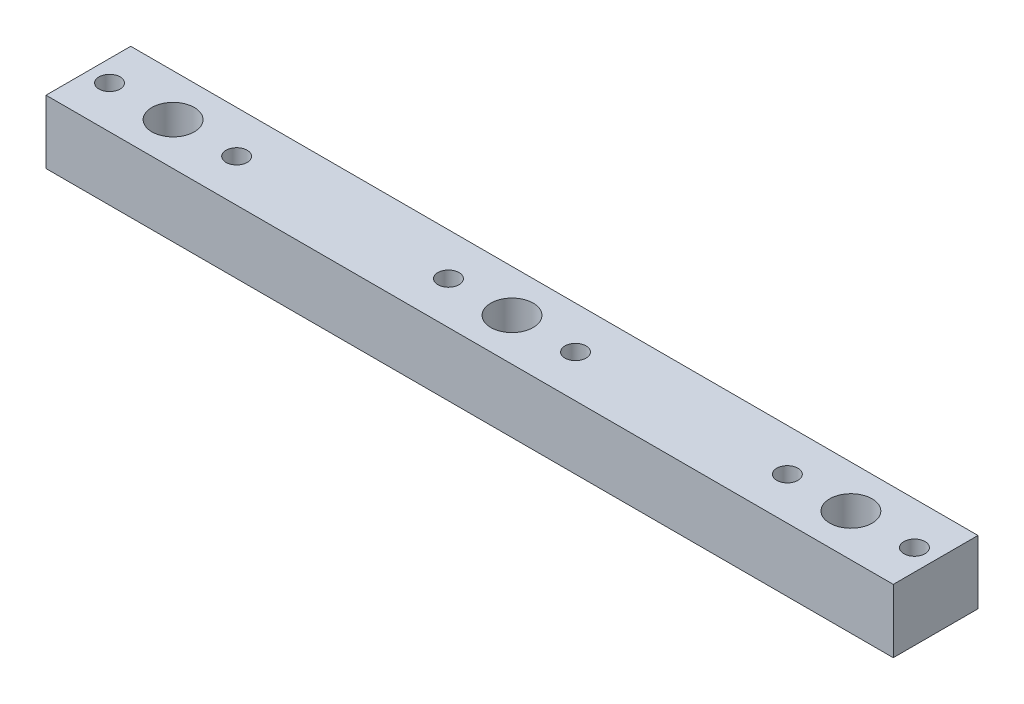
ISO-10303-21;
HEADER;
FILE_DESCRIPTION(('STEP AP214'),'2;1');
FILE_NAME('part.step','',(''),(''),'','','');
FILE_SCHEMA(('AUTOMOTIVE_DESIGN { 1 0 10303 214 1 1 1 1 }'));
ENDSEC;
DATA;
#1=APPLICATION_CONTEXT('core data for automotive mechanical design processes');
#2=APPLICATION_PROTOCOL_DEFINITION('international standard','automotive_design',2000,#1);
#3=PRODUCT_CONTEXT('',#1,'mechanical');
#4=PRODUCT('Part','Part','',(#3));
#5=PRODUCT_RELATED_PRODUCT_CATEGORY('part','',(#4));
#6=PRODUCT_DEFINITION_FORMATION('','',#4);
#7=PRODUCT_DEFINITION_CONTEXT('part definition',#1,'design');
#8=PRODUCT_DEFINITION('design','',#6,#7);
#9=PRODUCT_DEFINITION_SHAPE('','',#8);
#10=(LENGTH_UNIT() NAMED_UNIT(*) SI_UNIT(.MILLI.,.METRE.));
#11=(NAMED_UNIT(*) PLANE_ANGLE_UNIT() SI_UNIT($,.RADIAN.));
#12=(NAMED_UNIT(*) SI_UNIT($,.STERADIAN.) SOLID_ANGLE_UNIT());
#13=UNCERTAINTY_MEASURE_WITH_UNIT(LENGTH_MEASURE(1.E-05),#10,'distance_accuracy_value','');
#14=(GEOMETRIC_REPRESENTATION_CONTEXT(3) GLOBAL_UNCERTAINTY_ASSIGNED_CONTEXT((#13)) GLOBAL_UNIT_ASSIGNED_CONTEXT((#10,
#11,#12)) REPRESENTATION_CONTEXT('',''));
#15=CARTESIAN_POINT('',(0.,0.,0.));
#16=DIRECTION('',(0.,0.,1.));
#17=DIRECTION('',(1.,0.,0.));
#18=AXIS2_PLACEMENT_3D('',#15,#16,#17);
#19=CARTESIAN_POINT('',(0.,15.,0.));
#20=DIRECTION('',(0.,-1.,0.));
#21=DIRECTION('',(0.,0.,-1.));
#22=AXIS2_PLACEMENT_3D('',#19,#20,#21);
#23=PLANE('',#22);
#24=DIRECTION('',(0.,0.,1.));
#25=VECTOR('',#24,1.);
#26=CARTESIAN_POINT('',(0.,15.,0.));
#27=LINE('',#26,#25);
#28=CARTESIAN_POINT('',(0.,15.,-20.));
#29=VERTEX_POINT('',#28);
#30=CARTESIAN_POINT('',(0.,15.,0.));
#31=VERTEX_POINT('',#30);
#32=EDGE_CURVE('E92',#29,#31,#27,.T.);
#33=ORIENTED_EDGE('',*,*,#32,.T.);
#34=DIRECTION('',(1.,0.,0.));
#35=VECTOR('',#34,1.);
#36=CARTESIAN_POINT('',(0.,15.,0.));
#37=LINE('',#36,#35);
#38=CARTESIAN_POINT('',(200.,15.,0.));
#39=VERTEX_POINT('',#38);
#40=EDGE_CURVE('E87',#31,#39,#37,.T.);
#41=ORIENTED_EDGE('',*,*,#40,.T.);
#42=DIRECTION('',(0.,0.,-1.));
#43=VECTOR('',#42,1.);
#44=CARTESIAN_POINT('',(200.,15.,0.));
#45=LINE('',#44,#43);
#46=CARTESIAN_POINT('',(200.,15.,-20.));
#47=VERTEX_POINT('',#46);
#48=EDGE_CURVE('E90',#39,#47,#45,.T.);
#49=ORIENTED_EDGE('',*,*,#48,.T.);
#50=DIRECTION('',(-1.,0.,0.));
#51=VECTOR('',#50,1.);
#52=CARTESIAN_POINT('',(0.,15.,-20.));
#53=LINE('',#52,#51);
#54=EDGE_CURVE('E57',#47,#29,#53,.T.);
#55=ORIENTED_EDGE('',*,*,#54,.T.);
#56=EDGE_LOOP('',(#33,#41,#49,#55));
#57=FACE_BOUND('',#56,.T.);
#58=CARTESIAN_POINT('',(20.,15.,-10.));
#59=DIRECTION('',(0.,1.,0.));
#60=DIRECTION('',(0.,0.,1.));
#61=AXIS2_PLACEMENT_3D('',#58,#59,#60);
#62=CIRCLE('',#61,5.);
#63=CARTESIAN_POINT('',(20.,15.,-5.));
#64=VERTEX_POINT('',#63);
#65=EDGE_CURVE('E112',#64,#64,#62,.T.);
#66=ORIENTED_EDGE('',*,*,#65,.F.);
#67=EDGE_LOOP('',(#66));
#68=FACE_BOUND('',#67,.T.);
#69=CARTESIAN_POINT('',(35.,15.,-10.));
#70=DIRECTION('',(0.,1.,0.));
#71=DIRECTION('',(0.,0.,1.));
#72=AXIS2_PLACEMENT_3D('',#69,#70,#71);
#73=CIRCLE('',#72,2.49999999999999);
#74=CARTESIAN_POINT('',(35.,15.,-7.50000000000001));
#75=VERTEX_POINT('',#74);
#76=EDGE_CURVE('E134',#75,#75,#73,.T.);
#77=ORIENTED_EDGE('',*,*,#76,.F.);
#78=EDGE_LOOP('',(#77));
#79=FACE_BOUND('',#78,.T.);
#80=CARTESIAN_POINT('',(5.,15.,-10.));
#81=DIRECTION('',(0.,1.,0.));
#82=DIRECTION('',(0.,0.,1.));
#83=AXIS2_PLACEMENT_3D('',#80,#81,#82);
#84=CIRCLE('',#83,2.5);
#85=CARTESIAN_POINT('',(5.,15.,-7.50000000000001));
#86=VERTEX_POINT('',#85);
#87=EDGE_CURVE('E142',#86,#86,#84,.T.);
#88=ORIENTED_EDGE('',*,*,#87,.F.);
#89=EDGE_LOOP('',(#88));
#90=FACE_BOUND('',#89,.T.);
#91=CARTESIAN_POINT('',(100.,15.,-10.));
#92=DIRECTION('',(0.,1.,0.));
#93=DIRECTION('',(0.,0.,1.));
#94=AXIS2_PLACEMENT_3D('',#91,#92,#93);
#95=CIRCLE('',#94,5.);
#96=CARTESIAN_POINT('',(100.,15.,-5.));
#97=VERTEX_POINT('',#96);
#98=EDGE_CURVE('E150',#97,#97,#95,.T.);
#99=ORIENTED_EDGE('',*,*,#98,.F.);
#100=EDGE_LOOP('',(#99));
#101=FACE_BOUND('',#100,.T.);
#102=CARTESIAN_POINT('',(180.,15.,-10.));
#103=DIRECTION('',(0.,1.,0.));
#104=DIRECTION('',(0.,0.,1.));
#105=AXIS2_PLACEMENT_3D('',#102,#103,#104);
#106=CIRCLE('',#105,4.99999999999999);
#107=CARTESIAN_POINT('',(180.,15.,-5.00000000000001));
#108=VERTEX_POINT('',#107);
#109=EDGE_CURVE('E158',#108,#108,#106,.T.);
#110=ORIENTED_EDGE('',*,*,#109,.F.);
#111=EDGE_LOOP('',(#110));
#112=FACE_BOUND('',#111,.T.);
#113=CARTESIAN_POINT('',(195.,15.,-10.));
#114=DIRECTION('',(0.,1.,0.));
#115=DIRECTION('',(0.,0.,1.));
#116=AXIS2_PLACEMENT_3D('',#113,#114,#115);
#117=CIRCLE('',#116,2.50000000000002);
#118=CARTESIAN_POINT('',(195.,15.,-7.49999999999998));
#119=VERTEX_POINT('',#118);
#120=EDGE_CURVE('E166',#119,#119,#117,.T.);
#121=ORIENTED_EDGE('',*,*,#120,.F.);
#122=EDGE_LOOP('',(#121));
#123=FACE_BOUND('',#122,.T.);
#124=CARTESIAN_POINT('',(165.,15.,-10.));
#125=DIRECTION('',(0.,1.,0.));
#126=DIRECTION('',(0.,0.,1.));
#127=AXIS2_PLACEMENT_3D('',#124,#125,#126);
#128=CIRCLE('',#127,2.50000000000002);
#129=CARTESIAN_POINT('',(165.,15.,-7.49999999999998));
#130=VERTEX_POINT('',#129);
#131=EDGE_CURVE('E174',#130,#130,#128,.T.);
#132=ORIENTED_EDGE('',*,*,#131,.F.);
#133=EDGE_LOOP('',(#132));
#134=FACE_BOUND('',#133,.T.);
#135=CARTESIAN_POINT('',(115.,15.,-10.));
#136=DIRECTION('',(0.,1.,0.));
#137=DIRECTION('',(0.,0.,1.));
#138=AXIS2_PLACEMENT_3D('',#135,#136,#137);
#139=CIRCLE('',#138,2.49999999999998);
#140=CARTESIAN_POINT('',(115.,15.,-7.50000000000002));
#141=VERTEX_POINT('',#140);
#142=EDGE_CURVE('E182',#141,#141,#139,.T.);
#143=ORIENTED_EDGE('',*,*,#142,.F.);
#144=EDGE_LOOP('',(#143));
#145=FACE_BOUND('',#144,.T.);
#146=CARTESIAN_POINT('',(85.,15.,-10.));
#147=DIRECTION('',(0.,1.,0.));
#148=DIRECTION('',(0.,0.,1.));
#149=AXIS2_PLACEMENT_3D('',#146,#147,#148);
#150=CIRCLE('',#149,2.50000000000001);
#151=CARTESIAN_POINT('',(85.,15.,-7.49999999999999));
#152=VERTEX_POINT('',#151);
#153=EDGE_CURVE('E190',#152,#152,#150,.T.);
#154=ORIENTED_EDGE('',*,*,#153,.F.);
#155=EDGE_LOOP('',(#154));
#156=FACE_BOUND('',#155,.T.);
#157=ADVANCED_FACE('F39',(#57,#68,#79,#90,#101,#112,#123,#134,#145,#156),#23,.F.);
#158=CARTESIAN_POINT('',(0.,0.,0.));
#159=DIRECTION('',(0.,-1.,0.));
#160=DIRECTION('',(0.,0.,-1.));
#161=AXIS2_PLACEMENT_3D('',#158,#159,#160);
#162=PLANE('',#161);
#163=CARTESIAN_POINT('',(115.,0.,-10.));
#164=DIRECTION('',(0.,1.,0.));
#165=DIRECTION('',(0.,0.,1.));
#166=AXIS2_PLACEMENT_3D('',#163,#164,#165);
#167=CIRCLE('',#166,2.49999999999998);
#168=CARTESIAN_POINT('',(115.,0.,-7.50000000000002));
#169=VERTEX_POINT('',#168);
#170=EDGE_CURVE('E186',#169,#169,#167,.T.);
#171=ORIENTED_EDGE('',*,*,#170,.T.);
#172=EDGE_LOOP('',(#171));
#173=FACE_BOUND('',#172,.T.);
#174=CARTESIAN_POINT('',(195.,0.,-10.));
#175=DIRECTION('',(0.,1.,0.));
#176=DIRECTION('',(0.,0.,1.));
#177=AXIS2_PLACEMENT_3D('',#174,#175,#176);
#178=CIRCLE('',#177,2.50000000000002);
#179=CARTESIAN_POINT('',(195.,0.,-7.49999999999998));
#180=VERTEX_POINT('',#179);
#181=EDGE_CURVE('E170',#180,#180,#178,.T.);
#182=ORIENTED_EDGE('',*,*,#181,.T.);
#183=EDGE_LOOP('',(#182));
#184=FACE_BOUND('',#183,.T.);
#185=CARTESIAN_POINT('',(100.,0.,-10.));
#186=DIRECTION('',(0.,1.,0.));
#187=DIRECTION('',(0.,0.,1.));
#188=AXIS2_PLACEMENT_3D('',#185,#186,#187);
#189=CIRCLE('',#188,5.);
#190=CARTESIAN_POINT('',(100.,0.,-5.));
#191=VERTEX_POINT('',#190);
#192=EDGE_CURVE('E154',#191,#191,#189,.T.);
#193=ORIENTED_EDGE('',*,*,#192,.T.);
#194=EDGE_LOOP('',(#193));
#195=FACE_BOUND('',#194,.T.);
#196=CARTESIAN_POINT('',(35.,0.,-10.));
#197=DIRECTION('',(0.,1.,0.));
#198=DIRECTION('',(0.,0.,1.));
#199=AXIS2_PLACEMENT_3D('',#196,#197,#198);
#200=CIRCLE('',#199,2.49999999999999);
#201=CARTESIAN_POINT('',(35.,0.,-7.50000000000001));
#202=VERTEX_POINT('',#201);
#203=EDGE_CURVE('E138',#202,#202,#200,.T.);
#204=ORIENTED_EDGE('',*,*,#203,.T.);
#205=EDGE_LOOP('',(#204));
#206=FACE_BOUND('',#205,.T.);
#207=DIRECTION('',(0.,0.,1.));
#208=VECTOR('',#207,1.);
#209=CARTESIAN_POINT('',(0.,0.,0.));
#210=LINE('',#209,#208);
#211=CARTESIAN_POINT('',(0.,0.,-20.));
#212=VERTEX_POINT('',#211);
#213=CARTESIAN_POINT('',(0.,0.,0.));
#214=VERTEX_POINT('',#213);
#215=EDGE_CURVE('E108',#212,#214,#210,.T.);
#216=ORIENTED_EDGE('',*,*,#215,.F.);
#217=DIRECTION('',(-1.,0.,0.));
#218=VECTOR('',#217,1.);
#219=CARTESIAN_POINT('',(0.,0.,-20.));
#220=LINE('',#219,#218);
#221=CARTESIAN_POINT('',(200.,0.,-20.));
#222=VERTEX_POINT('',#221);
#223=EDGE_CURVE('E80',#222,#212,#220,.T.);
#224=ORIENTED_EDGE('',*,*,#223,.F.);
#225=DIRECTION('',(0.,0.,-1.));
#226=VECTOR('',#225,1.);
#227=CARTESIAN_POINT('',(200.,0.,0.));
#228=LINE('',#227,#226);
#229=CARTESIAN_POINT('',(200.,0.,0.));
#230=VERTEX_POINT('',#229);
#231=EDGE_CURVE('E74',#230,#222,#228,.T.);
#232=ORIENTED_EDGE('',*,*,#231,.F.);
#233=DIRECTION('',(1.,0.,0.));
#234=VECTOR('',#233,1.);
#235=CARTESIAN_POINT('',(0.,0.,0.));
#236=LINE('',#235,#234);
#237=EDGE_CURVE('E97',#214,#230,#236,.T.);
#238=ORIENTED_EDGE('',*,*,#237,.F.);
#239=EDGE_LOOP('',(#216,#224,#232,#238));
#240=FACE_BOUND('',#239,.T.);
#241=CARTESIAN_POINT('',(20.,0.,-10.));
#242=DIRECTION('',(0.,1.,0.));
#243=DIRECTION('',(0.,0.,1.));
#244=AXIS2_PLACEMENT_3D('',#241,#242,#243);
#245=CIRCLE('',#244,5.);
#246=CARTESIAN_POINT('',(20.,0.,-5.));
#247=VERTEX_POINT('',#246);
#248=EDGE_CURVE('E130',#247,#247,#245,.T.);
#249=ORIENTED_EDGE('',*,*,#248,.T.);
#250=EDGE_LOOP('',(#249));
#251=FACE_BOUND('',#250,.T.);
#252=CARTESIAN_POINT('',(5.,0.,-10.));
#253=DIRECTION('',(0.,1.,0.));
#254=DIRECTION('',(0.,0.,1.));
#255=AXIS2_PLACEMENT_3D('',#252,#253,#254);
#256=CIRCLE('',#255,2.5);
#257=CARTESIAN_POINT('',(5.,0.,-7.50000000000001));
#258=VERTEX_POINT('',#257);
#259=EDGE_CURVE('E146',#258,#258,#256,.T.);
#260=ORIENTED_EDGE('',*,*,#259,.T.);
#261=EDGE_LOOP('',(#260));
#262=FACE_BOUND('',#261,.T.);
#263=CARTESIAN_POINT('',(180.,0.,-10.));
#264=DIRECTION('',(0.,1.,0.));
#265=DIRECTION('',(0.,0.,1.));
#266=AXIS2_PLACEMENT_3D('',#263,#264,#265);
#267=CIRCLE('',#266,4.99999999999999);
#268=CARTESIAN_POINT('',(180.,0.,-5.00000000000001));
#269=VERTEX_POINT('',#268);
#270=EDGE_CURVE('E162',#269,#269,#267,.T.);
#271=ORIENTED_EDGE('',*,*,#270,.T.);
#272=EDGE_LOOP('',(#271));
#273=FACE_BOUND('',#272,.T.);
#274=CARTESIAN_POINT('',(165.,0.,-10.));
#275=DIRECTION('',(0.,1.,0.));
#276=DIRECTION('',(0.,0.,1.));
#277=AXIS2_PLACEMENT_3D('',#274,#275,#276);
#278=CIRCLE('',#277,2.50000000000002);
#279=CARTESIAN_POINT('',(165.,0.,-7.49999999999998));
#280=VERTEX_POINT('',#279);
#281=EDGE_CURVE('E178',#280,#280,#278,.T.);
#282=ORIENTED_EDGE('',*,*,#281,.T.);
#283=EDGE_LOOP('',(#282));
#284=FACE_BOUND('',#283,.T.);
#285=CARTESIAN_POINT('',(85.,0.,-10.));
#286=DIRECTION('',(0.,1.,0.));
#287=DIRECTION('',(0.,0.,1.));
#288=AXIS2_PLACEMENT_3D('',#285,#286,#287);
#289=CIRCLE('',#288,2.50000000000001);
#290=CARTESIAN_POINT('',(85.,0.,-7.49999999999999));
#291=VERTEX_POINT('',#290);
#292=EDGE_CURVE('E194',#291,#291,#289,.T.);
#293=ORIENTED_EDGE('',*,*,#292,.T.);
#294=EDGE_LOOP('',(#293));
#295=FACE_BOUND('',#294,.T.);
#296=ADVANCED_FACE('F125',(#173,#184,#195,#206,#240,#251,#262,#273,#284,#295),#162,.T.);
#297=CARTESIAN_POINT('',(0.,15.,0.));
#298=DIRECTION('',(1.,0.,0.));
#299=DIRECTION('',(0.,0.,-1.));
#300=AXIS2_PLACEMENT_3D('',#297,#298,#299);
#301=PLANE('',#300);
#302=ORIENTED_EDGE('',*,*,#215,.T.);
#303=DIRECTION('',(0.,-1.,0.));
#304=VECTOR('',#303,1.);
#305=CARTESIAN_POINT('',(0.,15.,0.));
#306=LINE('',#305,#304);
#307=EDGE_CURVE('E11',#31,#214,#306,.T.);
#308=ORIENTED_EDGE('',*,*,#307,.F.);
#309=ORIENTED_EDGE('',*,*,#32,.F.);
#310=DIRECTION('',(0.,-1.,0.));
#311=VECTOR('',#310,1.);
#312=CARTESIAN_POINT('',(0.,15.,-20.));
#313=LINE('',#312,#311);
#314=EDGE_CURVE('E104',#29,#212,#313,.T.);
#315=ORIENTED_EDGE('',*,*,#314,.T.);
#316=EDGE_LOOP('',(#302,#308,#309,#315));
#317=FACE_BOUND('',#316,.T.);
#318=ADVANCED_FACE('F41',(#317),#301,.F.);
#319=CARTESIAN_POINT('',(0.,15.,0.));
#320=DIRECTION('',(0.,0.,-1.));
#321=DIRECTION('',(-1.,0.,0.));
#322=AXIS2_PLACEMENT_3D('',#319,#320,#321);
#323=PLANE('',#322);
#324=ORIENTED_EDGE('',*,*,#237,.T.);
#325=DIRECTION('',(0.,-1.,0.));
#326=VECTOR('',#325,1.);
#327=CARTESIAN_POINT('',(200.,15.,0.));
#328=LINE('',#327,#326);
#329=EDGE_CURVE('E49',#39,#230,#328,.T.);
#330=ORIENTED_EDGE('',*,*,#329,.F.);
#331=ORIENTED_EDGE('',*,*,#40,.F.);
#332=ORIENTED_EDGE('',*,*,#307,.T.);
#333=EDGE_LOOP('',(#324,#330,#331,#332));
#334=FACE_BOUND('',#333,.T.);
#335=ADVANCED_FACE('F96',(#334),#323,.F.);
#336=CARTESIAN_POINT('',(200.,15.,0.));
#337=DIRECTION('',(-1.,0.,0.));
#338=DIRECTION('',(0.,0.,1.));
#339=AXIS2_PLACEMENT_3D('',#336,#337,#338);
#340=PLANE('',#339);
#341=ORIENTED_EDGE('',*,*,#231,.T.);
#342=DIRECTION('',(0.,-1.,0.));
#343=VECTOR('',#342,1.);
#344=CARTESIAN_POINT('',(200.,15.,-20.));
#345=LINE('',#344,#343);
#346=EDGE_CURVE('E99',#47,#222,#345,.T.);
#347=ORIENTED_EDGE('',*,*,#346,.F.);
#348=ORIENTED_EDGE('',*,*,#48,.F.);
#349=ORIENTED_EDGE('',*,*,#329,.T.);
#350=EDGE_LOOP('',(#341,#347,#348,#349));
#351=FACE_BOUND('',#350,.T.);
#352=ADVANCED_FACE('F100',(#351),#340,.F.);
#353=CARTESIAN_POINT('',(0.,15.,-20.));
#354=DIRECTION('',(0.,0.,1.));
#355=DIRECTION('',(1.,0.,0.));
#356=AXIS2_PLACEMENT_3D('',#353,#354,#355);
#357=PLANE('',#356);
#358=ORIENTED_EDGE('',*,*,#223,.T.);
#359=ORIENTED_EDGE('',*,*,#314,.F.);
#360=ORIENTED_EDGE('',*,*,#54,.F.);
#361=ORIENTED_EDGE('',*,*,#346,.T.);
#362=EDGE_LOOP('',(#358,#359,#360,#361));
#363=FACE_BOUND('',#362,.T.);
#364=ADVANCED_FACE('F122',(#363),#357,.F.);
#365=CARTESIAN_POINT('',(20.,15.,-10.));
#366=DIRECTION('',(0.,-1.,0.));
#367=DIRECTION('',(0.,0.,-1.));
#368=AXIS2_PLACEMENT_3D('',#365,#366,#367);
#369=CYLINDRICAL_SURFACE('',#368,5.);
#370=ORIENTED_EDGE('',*,*,#65,.T.);
#371=EDGE_LOOP('',(#370));
#372=FACE_BOUND('',#371,.T.);
#373=ORIENTED_EDGE('',*,*,#248,.F.);
#374=EDGE_LOOP('',(#373));
#375=FACE_BOUND('',#374,.T.);
#376=ADVANCED_FACE('F213',(#372,#375),#369,.F.);
#377=CARTESIAN_POINT('',(35.,15.,-10.));
#378=DIRECTION('',(0.,-1.,0.));
#379=DIRECTION('',(0.,0.,-1.));
#380=AXIS2_PLACEMENT_3D('',#377,#378,#379);
#381=CYLINDRICAL_SURFACE('',#380,2.49999999999999);
#382=ORIENTED_EDGE('',*,*,#76,.T.);
#383=EDGE_LOOP('',(#382));
#384=FACE_BOUND('',#383,.T.);
#385=ORIENTED_EDGE('',*,*,#203,.F.);
#386=EDGE_LOOP('',(#385));
#387=FACE_BOUND('',#386,.T.);
#388=ADVANCED_FACE('F259',(#384,#387),#381,.F.);
#389=CARTESIAN_POINT('',(5.,15.,-10.));
#390=DIRECTION('',(0.,-1.,0.));
#391=DIRECTION('',(0.,0.,-1.));
#392=AXIS2_PLACEMENT_3D('',#389,#390,#391);
#393=CYLINDRICAL_SURFACE('',#392,2.5);
#394=ORIENTED_EDGE('',*,*,#87,.T.);
#395=EDGE_LOOP('',(#394));
#396=FACE_BOUND('',#395,.T.);
#397=ORIENTED_EDGE('',*,*,#259,.F.);
#398=EDGE_LOOP('',(#397));
#399=FACE_BOUND('',#398,.T.);
#400=ADVANCED_FACE('F267',(#396,#399),#393,.F.);
#401=CARTESIAN_POINT('',(100.,15.,-10.));
#402=DIRECTION('',(0.,-1.,0.));
#403=DIRECTION('',(0.,0.,-1.));
#404=AXIS2_PLACEMENT_3D('',#401,#402,#403);
#405=CYLINDRICAL_SURFACE('',#404,5.);
#406=ORIENTED_EDGE('',*,*,#98,.T.);
#407=EDGE_LOOP('',(#406));
#408=FACE_BOUND('',#407,.T.);
#409=ORIENTED_EDGE('',*,*,#192,.F.);
#410=EDGE_LOOP('',(#409));
#411=FACE_BOUND('',#410,.T.);
#412=ADVANCED_FACE('F275',(#408,#411),#405,.F.);
#413=CARTESIAN_POINT('',(180.,15.,-10.));
#414=DIRECTION('',(0.,-1.,0.));
#415=DIRECTION('',(0.,0.,-1.));
#416=AXIS2_PLACEMENT_3D('',#413,#414,#415);
#417=CYLINDRICAL_SURFACE('',#416,4.99999999999999);
#418=ORIENTED_EDGE('',*,*,#109,.T.);
#419=EDGE_LOOP('',(#418));
#420=FACE_BOUND('',#419,.T.);
#421=ORIENTED_EDGE('',*,*,#270,.F.);
#422=EDGE_LOOP('',(#421));
#423=FACE_BOUND('',#422,.T.);
#424=ADVANCED_FACE('F284',(#420,#423),#417,.F.);
#425=CARTESIAN_POINT('',(195.,15.,-10.));
#426=DIRECTION('',(0.,-1.,0.));
#427=DIRECTION('',(0.,0.,-1.));
#428=AXIS2_PLACEMENT_3D('',#425,#426,#427);
#429=CYLINDRICAL_SURFACE('',#428,2.50000000000002);
#430=ORIENTED_EDGE('',*,*,#120,.T.);
#431=EDGE_LOOP('',(#430));
#432=FACE_BOUND('',#431,.T.);
#433=ORIENTED_EDGE('',*,*,#181,.F.);
#434=EDGE_LOOP('',(#433));
#435=FACE_BOUND('',#434,.T.);
#436=ADVANCED_FACE('F293',(#432,#435),#429,.F.);
#437=CARTESIAN_POINT('',(165.,15.,-10.));
#438=DIRECTION('',(0.,-1.,0.));
#439=DIRECTION('',(0.,0.,-1.));
#440=AXIS2_PLACEMENT_3D('',#437,#438,#439);
#441=CYLINDRICAL_SURFACE('',#440,2.50000000000002);
#442=ORIENTED_EDGE('',*,*,#131,.T.);
#443=EDGE_LOOP('',(#442));
#444=FACE_BOUND('',#443,.T.);
#445=ORIENTED_EDGE('',*,*,#281,.F.);
#446=EDGE_LOOP('',(#445));
#447=FACE_BOUND('',#446,.T.);
#448=ADVANCED_FACE('F302',(#444,#447),#441,.F.);
#449=CARTESIAN_POINT('',(115.,15.,-10.));
#450=DIRECTION('',(0.,-1.,0.));
#451=DIRECTION('',(0.,0.,-1.));
#452=AXIS2_PLACEMENT_3D('',#449,#450,#451);
#453=CYLINDRICAL_SURFACE('',#452,2.49999999999998);
#454=ORIENTED_EDGE('',*,*,#142,.T.);
#455=EDGE_LOOP('',(#454));
#456=FACE_BOUND('',#455,.T.);
#457=ORIENTED_EDGE('',*,*,#170,.F.);
#458=EDGE_LOOP('',(#457));
#459=FACE_BOUND('',#458,.T.);
#460=ADVANCED_FACE('F311',(#456,#459),#453,.F.);
#461=CARTESIAN_POINT('',(85.,15.,-10.));
#462=DIRECTION('',(0.,-1.,0.));
#463=DIRECTION('',(0.,0.,-1.));
#464=AXIS2_PLACEMENT_3D('',#461,#462,#463);
#465=CYLINDRICAL_SURFACE('',#464,2.50000000000001);
#466=ORIENTED_EDGE('',*,*,#153,.T.);
#467=EDGE_LOOP('',(#466));
#468=FACE_BOUND('',#467,.T.);
#469=ORIENTED_EDGE('',*,*,#292,.F.);
#470=EDGE_LOOP('',(#469));
#471=FACE_BOUND('',#470,.T.);
#472=ADVANCED_FACE('F202',(#468,#471),#465,.F.);
#473=CLOSED_SHELL('',(#157,#296,#318,#335,#352,#364,#376,#388,#400,#412,#424,#436,#448,#460,#472));
#474=MANIFOLD_SOLID_BREP('B2',#473);
#475=ADVANCED_BREP_SHAPE_REPRESENTATION('',(#18,#474),#14);
#476=SHAPE_DEFINITION_REPRESENTATION(#9,#475);
ENDSEC;
END-ISO-10303-21;
